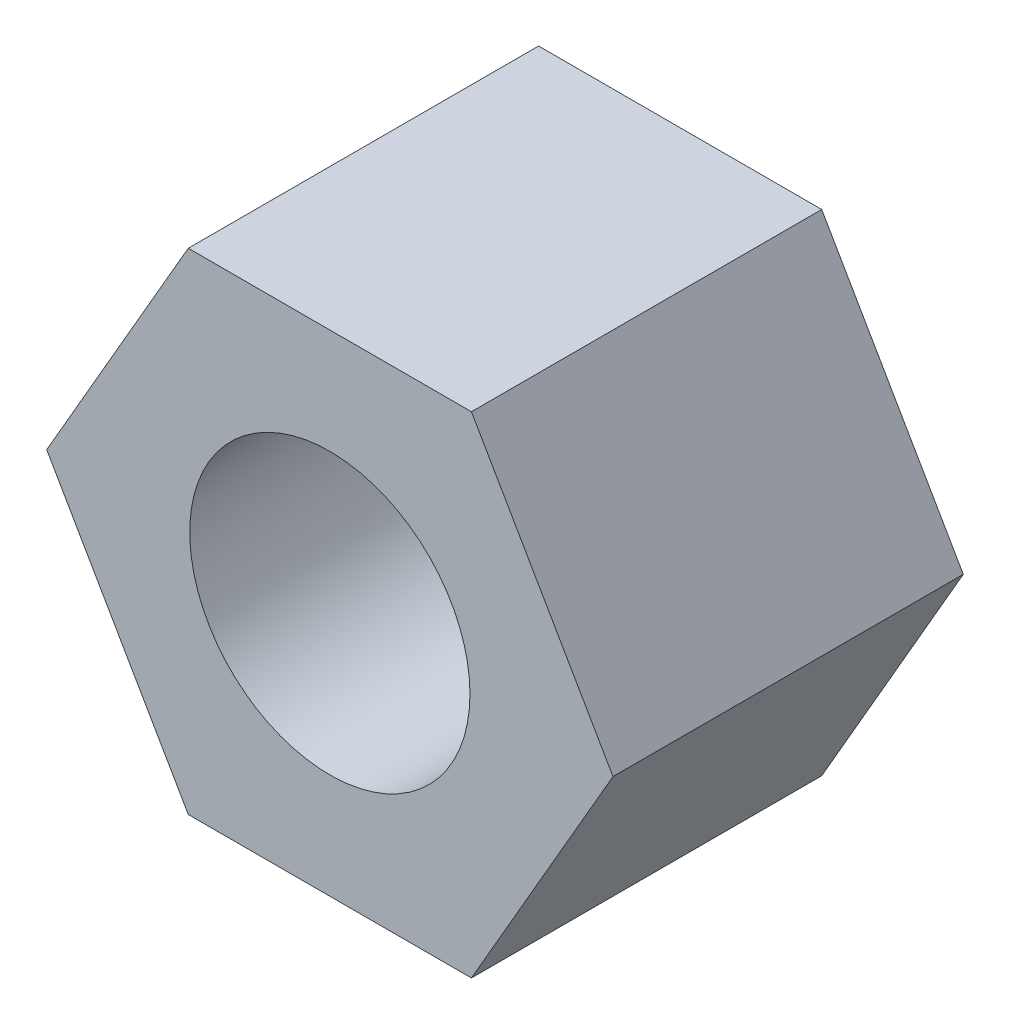
ISO-10303-21;
HEADER;
FILE_DESCRIPTION(('STEP AP214'),'2;1');
FILE_NAME('part.step','',(''),(''),'','','');
FILE_SCHEMA(('AUTOMOTIVE_DESIGN { 1 0 10303 214 1 1 1 1 }'));
ENDSEC;
DATA;
#1=APPLICATION_CONTEXT('core data for automotive mechanical design processes');
#2=APPLICATION_PROTOCOL_DEFINITION('international standard','automotive_design',2000,#1);
#3=PRODUCT_CONTEXT('',#1,'mechanical');
#4=PRODUCT('Part','Part','',(#3));
#5=PRODUCT_RELATED_PRODUCT_CATEGORY('part','',(#4));
#6=PRODUCT_DEFINITION_FORMATION('','',#4);
#7=PRODUCT_DEFINITION_CONTEXT('part definition',#1,'design');
#8=PRODUCT_DEFINITION('design','',#6,#7);
#9=PRODUCT_DEFINITION_SHAPE('','',#8);
#10=(LENGTH_UNIT() NAMED_UNIT(*) SI_UNIT(.MILLI.,.METRE.));
#11=(NAMED_UNIT(*) PLANE_ANGLE_UNIT() SI_UNIT($,.RADIAN.));
#12=(NAMED_UNIT(*) SI_UNIT($,.STERADIAN.) SOLID_ANGLE_UNIT());
#13=UNCERTAINTY_MEASURE_WITH_UNIT(LENGTH_MEASURE(1.E-05),#10,'distance_accuracy_value','');
#14=(GEOMETRIC_REPRESENTATION_CONTEXT(3) GLOBAL_UNCERTAINTY_ASSIGNED_CONTEXT((#13)) GLOBAL_UNIT_ASSIGNED_CONTEXT((#10,
#11,#12)) REPRESENTATION_CONTEXT('',''));
#15=CARTESIAN_POINT('',(0.,0.,0.));
#16=DIRECTION('',(0.,0.,1.));
#17=DIRECTION('',(1.,0.,0.));
#18=AXIS2_PLACEMENT_3D('',#15,#16,#17);
#19=CARTESIAN_POINT('',(0.,0.,5.));
#20=DIRECTION('',(0.,0.,1.));
#21=DIRECTION('',(1.,0.,0.));
#22=AXIS2_PLACEMENT_3D('',#19,#20,#21);
#23=PLANE('',#22);
#24=DIRECTION('',(-1.,0.,0.));
#25=VECTOR('',#24,1.);
#26=CARTESIAN_POINT('',(2.02072594216369,3.5,5.));
#27=LINE('',#26,#25);
#28=CARTESIAN_POINT('',(2.02072594216369,3.5,5.));
#29=VERTEX_POINT('',#28);
#30=CARTESIAN_POINT('',(-2.02072594216369,3.5,5.));
#31=VERTEX_POINT('',#30);
#32=EDGE_CURVE('E129',#29,#31,#27,.T.);
#33=ORIENTED_EDGE('',*,*,#32,.T.);
#34=DIRECTION('',(-0.5,-0.866025403784439,0.));
#35=VECTOR('',#34,1.);
#36=CARTESIAN_POINT('',(-2.02072594216369,3.5,5.));
#37=LINE('',#36,#35);
#38=CARTESIAN_POINT('',(-4.04145188432738,0.,5.));
#39=VERTEX_POINT('',#38);
#40=EDGE_CURVE('E87',#31,#39,#37,.T.);
#41=ORIENTED_EDGE('',*,*,#40,.T.);
#42=DIRECTION('',(0.5,-0.866025403784439,0.));
#43=VECTOR('',#42,1.);
#44=CARTESIAN_POINT('',(-4.04145188432738,0.,5.));
#45=LINE('',#44,#43);
#46=CARTESIAN_POINT('',(-2.02072594216369,-3.5,5.));
#47=VERTEX_POINT('',#46);
#48=EDGE_CURVE('E100',#39,#47,#45,.T.);
#49=ORIENTED_EDGE('',*,*,#48,.T.);
#50=DIRECTION('',(1.,0.,0.));
#51=VECTOR('',#50,1.);
#52=CARTESIAN_POINT('',(-2.02072594216369,-3.5,5.));
#53=LINE('',#52,#51);
#54=CARTESIAN_POINT('',(2.02072594216369,-3.5,5.));
#55=VERTEX_POINT('',#54);
#56=EDGE_CURVE('E94',#47,#55,#53,.T.);
#57=ORIENTED_EDGE('',*,*,#56,.T.);
#58=DIRECTION('',(0.5,0.866025403784439,0.));
#59=VECTOR('',#58,1.);
#60=CARTESIAN_POINT('',(2.02072594216369,-3.5,5.));
#61=LINE('',#60,#59);
#62=CARTESIAN_POINT('',(4.04145188432738,0.,5.));
#63=VERTEX_POINT('',#62);
#64=EDGE_CURVE('E98',#55,#63,#61,.T.);
#65=ORIENTED_EDGE('',*,*,#64,.T.);
#66=DIRECTION('',(-0.5,0.866025403784439,0.));
#67=VECTOR('',#66,1.);
#68=CARTESIAN_POINT('',(4.04145188432738,0.,5.));
#69=LINE('',#68,#67);
#70=EDGE_CURVE('E50',#63,#29,#69,.T.);
#71=ORIENTED_EDGE('',*,*,#70,.T.);
#72=EDGE_LOOP('',(#33,#41,#49,#57,#65,#71));
#73=FACE_BOUND('',#72,.T.);
#74=CARTESIAN_POINT('',(0.,0.,5.));
#75=DIRECTION('',(0.,0.,1.));
#76=DIRECTION('',(1.,0.,0.));
#77=AXIS2_PLACEMENT_3D('',#74,#75,#76);
#78=CIRCLE('',#77,2.);
#79=CARTESIAN_POINT('',(2.,0.,5.));
#80=VERTEX_POINT('',#79);
#81=EDGE_CURVE('E122',#80,#80,#78,.T.);
#82=ORIENTED_EDGE('',*,*,#81,.F.);
#83=EDGE_LOOP('',(#82));
#84=FACE_BOUND('',#83,.T.);
#85=ADVANCED_FACE('F33',(#73,#84),#23,.T.);
#86=CARTESIAN_POINT('',(0.,0.,0.));
#87=DIRECTION('',(0.,0.,1.));
#88=DIRECTION('',(1.,0.,0.));
#89=AXIS2_PLACEMENT_3D('',#86,#87,#88);
#90=PLANE('',#89);
#91=DIRECTION('',(-1.,0.,0.));
#92=VECTOR('',#91,1.);
#93=CARTESIAN_POINT('',(2.02072594216369,3.5,0.));
#94=LINE('',#93,#92);
#95=CARTESIAN_POINT('',(2.02072594216369,3.5,0.));
#96=VERTEX_POINT('',#95);
#97=CARTESIAN_POINT('',(-2.02072594216369,3.5,0.));
#98=VERTEX_POINT('',#97);
#99=EDGE_CURVE('E118',#96,#98,#94,.T.);
#100=ORIENTED_EDGE('',*,*,#99,.F.);
#101=DIRECTION('',(-0.5,0.866025403784439,0.));
#102=VECTOR('',#101,1.);
#103=CARTESIAN_POINT('',(4.04145188432738,0.,0.));
#104=LINE('',#103,#102);
#105=CARTESIAN_POINT('',(4.04145188432738,0.,0.));
#106=VERTEX_POINT('',#105);
#107=EDGE_CURVE('E79',#106,#96,#104,.T.);
#108=ORIENTED_EDGE('',*,*,#107,.F.);
#109=DIRECTION('',(0.5,0.866025403784439,0.));
#110=VECTOR('',#109,1.);
#111=CARTESIAN_POINT('',(2.02072594216369,-3.5,0.));
#112=LINE('',#111,#110);
#113=CARTESIAN_POINT('',(2.02072594216369,-3.5,0.));
#114=VERTEX_POINT('',#113);
#115=EDGE_CURVE('E73',#114,#106,#112,.T.);
#116=ORIENTED_EDGE('',*,*,#115,.F.);
#117=DIRECTION('',(1.,0.,0.));
#118=VECTOR('',#117,1.);
#119=CARTESIAN_POINT('',(-2.02072594216369,-3.5,0.));
#120=LINE('',#119,#118);
#121=CARTESIAN_POINT('',(-2.02072594216369,-3.5,0.));
#122=VERTEX_POINT('',#121);
#123=EDGE_CURVE('E108',#122,#114,#120,.T.);
#124=ORIENTED_EDGE('',*,*,#123,.F.);
#125=DIRECTION('',(0.5,-0.866025403784439,0.));
#126=VECTOR('',#125,1.);
#127=CARTESIAN_POINT('',(-4.04145188432738,0.,0.));
#128=LINE('',#127,#126);
#129=CARTESIAN_POINT('',(-4.04145188432738,0.,0.));
#130=VERTEX_POINT('',#129);
#131=EDGE_CURVE('E124',#130,#122,#128,.T.);
#132=ORIENTED_EDGE('',*,*,#131,.F.);
#133=DIRECTION('',(-0.5,-0.866025403784439,0.));
#134=VECTOR('',#133,1.);
#135=CARTESIAN_POINT('',(-2.02072594216369,3.5,0.));
#136=LINE('',#135,#134);
#137=EDGE_CURVE('E121',#98,#130,#136,.T.);
#138=ORIENTED_EDGE('',*,*,#137,.F.);
#139=EDGE_LOOP('',(#100,#108,#116,#124,#132,#138));
#140=FACE_BOUND('',#139,.T.);
#141=CARTESIAN_POINT('',(0.,0.,0.));
#142=DIRECTION('',(0.,0.,1.));
#143=DIRECTION('',(1.,0.,0.));
#144=AXIS2_PLACEMENT_3D('',#141,#142,#143);
#145=CIRCLE('',#144,2.);
#146=CARTESIAN_POINT('',(2.,0.,0.));
#147=VERTEX_POINT('',#146);
#148=EDGE_CURVE('E222',#147,#147,#145,.T.);
#149=ORIENTED_EDGE('',*,*,#148,.T.);
#150=EDGE_LOOP('',(#149));
#151=FACE_BOUND('',#150,.T.);
#152=ADVANCED_FACE('F138',(#140,#151),#90,.F.);
#153=CARTESIAN_POINT('',(2.02072594216369,3.5,5.));
#154=DIRECTION('',(0.,-1.,0.));
#155=DIRECTION('',(1.,0.,0.));
#156=AXIS2_PLACEMENT_3D('',#153,#154,#155);
#157=PLANE('',#156);
#158=ORIENTED_EDGE('',*,*,#99,.T.);
#159=DIRECTION('',(0.,0.,-1.));
#160=VECTOR('',#159,1.);
#161=CARTESIAN_POINT('',(-2.02072594216369,3.5,5.));
#162=LINE('',#161,#160);
#163=EDGE_CURVE('E11',#31,#98,#162,.T.);
#164=ORIENTED_EDGE('',*,*,#163,.F.);
#165=ORIENTED_EDGE('',*,*,#32,.F.);
#166=DIRECTION('',(0.,0.,-1.));
#167=VECTOR('',#166,1.);
#168=CARTESIAN_POINT('',(2.02072594216369,3.5,5.));
#169=LINE('',#168,#167);
#170=EDGE_CURVE('E114',#29,#96,#169,.T.);
#171=ORIENTED_EDGE('',*,*,#170,.T.);
#172=EDGE_LOOP('',(#158,#164,#165,#171));
#173=FACE_BOUND('',#172,.T.);
#174=ADVANCED_FACE('F35',(#173),#157,.F.);
#175=CARTESIAN_POINT('',(-2.02072594216369,3.5,5.));
#176=DIRECTION('',(0.866025403784438,-0.5,0.));
#177=DIRECTION('',(0.5,0.866025403784438,0.));
#178=AXIS2_PLACEMENT_3D('',#175,#176,#177);
#179=PLANE('',#178);
#180=ORIENTED_EDGE('',*,*,#137,.T.);
#181=DIRECTION('',(0.,0.,-1.));
#182=VECTOR('',#181,1.);
#183=CARTESIAN_POINT('',(-4.04145188432738,0.,5.));
#184=LINE('',#183,#182);
#185=EDGE_CURVE('E42',#39,#130,#184,.T.);
#186=ORIENTED_EDGE('',*,*,#185,.F.);
#187=ORIENTED_EDGE('',*,*,#40,.F.);
#188=ORIENTED_EDGE('',*,*,#163,.T.);
#189=EDGE_LOOP('',(#180,#186,#187,#188));
#190=FACE_BOUND('',#189,.T.);
#191=ADVANCED_FACE('F163',(#190),#179,.F.);
#192=CARTESIAN_POINT('',(-4.04145188432738,0.,5.));
#193=DIRECTION('',(0.866025403784439,0.5,0.));
#194=DIRECTION('',(-0.5,0.866025403784439,0.));
#195=AXIS2_PLACEMENT_3D('',#192,#193,#194);
#196=PLANE('',#195);
#197=ORIENTED_EDGE('',*,*,#131,.T.);
#198=DIRECTION('',(0.,0.,-1.));
#199=VECTOR('',#198,1.);
#200=CARTESIAN_POINT('',(-2.02072594216369,-3.5,5.));
#201=LINE('',#200,#199);
#202=EDGE_CURVE('E109',#47,#122,#201,.T.);
#203=ORIENTED_EDGE('',*,*,#202,.F.);
#204=ORIENTED_EDGE('',*,*,#48,.F.);
#205=ORIENTED_EDGE('',*,*,#185,.T.);
#206=EDGE_LOOP('',(#197,#203,#204,#205));
#207=FACE_BOUND('',#206,.T.);
#208=ADVANCED_FACE('F135',(#207),#196,.F.);
#209=CARTESIAN_POINT('',(-2.02072594216369,-3.5,5.));
#210=DIRECTION('',(0.,1.,0.));
#211=DIRECTION('',(0.,0.,1.));
#212=AXIS2_PLACEMENT_3D('',#209,#210,#211);
#213=PLANE('',#212);
#214=ORIENTED_EDGE('',*,*,#123,.T.);
#215=DIRECTION('',(0.,0.,-1.));
#216=VECTOR('',#215,1.);
#217=CARTESIAN_POINT('',(2.02072594216369,-3.5,5.));
#218=LINE('',#217,#216);
#219=EDGE_CURVE('E105',#55,#114,#218,.T.);
#220=ORIENTED_EDGE('',*,*,#219,.F.);
#221=ORIENTED_EDGE('',*,*,#56,.F.);
#222=ORIENTED_EDGE('',*,*,#202,.T.);
#223=EDGE_LOOP('',(#214,#220,#221,#222));
#224=FACE_BOUND('',#223,.T.);
#225=ADVANCED_FACE('F106',(#224),#213,.F.);
#226=CARTESIAN_POINT('',(2.02072594216369,-3.5,5.));
#227=DIRECTION('',(-0.866025403784439,0.5,0.));
#228=DIRECTION('',(-0.5,-0.866025403784439,0.));
#229=AXIS2_PLACEMENT_3D('',#226,#227,#228);
#230=PLANE('',#229);
#231=ORIENTED_EDGE('',*,*,#115,.T.);
#232=DIRECTION('',(0.,0.,-1.));
#233=VECTOR('',#232,1.);
#234=CARTESIAN_POINT('',(4.04145188432738,0.,5.));
#235=LINE('',#234,#233);
#236=EDGE_CURVE('E110',#63,#106,#235,.T.);
#237=ORIENTED_EDGE('',*,*,#236,.F.);
#238=ORIENTED_EDGE('',*,*,#64,.F.);
#239=ORIENTED_EDGE('',*,*,#219,.T.);
#240=EDGE_LOOP('',(#231,#237,#238,#239));
#241=FACE_BOUND('',#240,.T.);
#242=ADVANCED_FACE('F112',(#241),#230,.F.);
#243=CARTESIAN_POINT('',(4.04145188432738,0.,5.));
#244=DIRECTION('',(-0.866025403784439,-0.5,0.));
#245=DIRECTION('',(0.5,-0.866025403784439,0.));
#246=AXIS2_PLACEMENT_3D('',#243,#244,#245);
#247=PLANE('',#246);
#248=ORIENTED_EDGE('',*,*,#107,.T.);
#249=ORIENTED_EDGE('',*,*,#170,.F.);
#250=ORIENTED_EDGE('',*,*,#70,.F.);
#251=ORIENTED_EDGE('',*,*,#236,.T.);
#252=EDGE_LOOP('',(#248,#249,#250,#251));
#253=FACE_BOUND('',#252,.T.);
#254=ADVANCED_FACE('F143',(#253),#247,.F.);
#255=CARTESIAN_POINT('',(0.,0.,5.));
#256=DIRECTION('',(0.,0.,-1.));
#257=DIRECTION('',(-1.,0.,0.));
#258=AXIS2_PLACEMENT_3D('',#255,#256,#257);
#259=CYLINDRICAL_SURFACE('',#258,2.);
#260=ORIENTED_EDGE('',*,*,#81,.T.);
#261=EDGE_LOOP('',(#260));
#262=FACE_BOUND('',#261,.T.);
#263=ORIENTED_EDGE('',*,*,#148,.F.);
#264=EDGE_LOOP('',(#263));
#265=FACE_BOUND('',#264,.T.);
#266=ADVANCED_FACE('F145',(#262,#265),#259,.F.);
#267=CLOSED_SHELL('',(#85,#152,#174,#191,#208,#225,#242,#254,#266));
#268=MANIFOLD_SOLID_BREP('B2',#267);
#269=ADVANCED_BREP_SHAPE_REPRESENTATION('',(#18,#268),#14);
#270=SHAPE_DEFINITION_REPRESENTATION(#9,#269);
ENDSEC;
END-ISO-10303-21;
